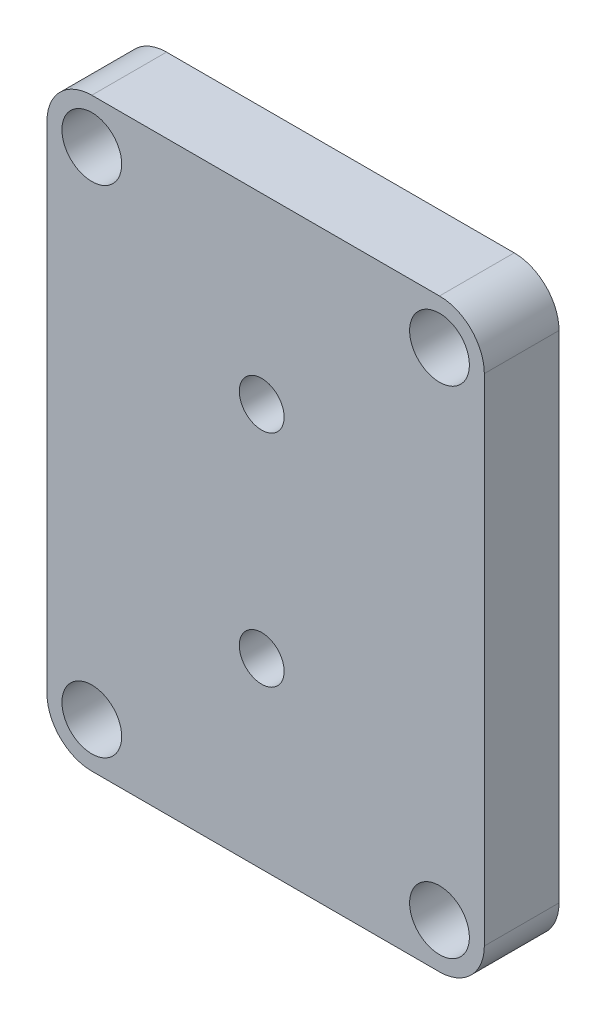
ISO-10303-21;
HEADER;
FILE_DESCRIPTION(('STEP AP214'),'2;1');
FILE_NAME('part.step','',(''),(''),'','','');
FILE_SCHEMA(('AUTOMOTIVE_DESIGN { 1 0 10303 214 1 1 1 1 }'));
ENDSEC;
DATA;
#1=APPLICATION_CONTEXT('core data for automotive mechanical design processes');
#2=APPLICATION_PROTOCOL_DEFINITION('international standard','automotive_design',2000,#1);
#3=PRODUCT_CONTEXT('',#1,'mechanical');
#4=PRODUCT('Part','Part','',(#3));
#5=PRODUCT_RELATED_PRODUCT_CATEGORY('part','',(#4));
#6=PRODUCT_DEFINITION_FORMATION('','',#4);
#7=PRODUCT_DEFINITION_CONTEXT('part definition',#1,'design');
#8=PRODUCT_DEFINITION('design','',#6,#7);
#9=PRODUCT_DEFINITION_SHAPE('','',#8);
#10=(LENGTH_UNIT() NAMED_UNIT(*) SI_UNIT(.MILLI.,.METRE.));
#11=(NAMED_UNIT(*) PLANE_ANGLE_UNIT() SI_UNIT($,.RADIAN.));
#12=(NAMED_UNIT(*) SI_UNIT($,.STERADIAN.) SOLID_ANGLE_UNIT());
#13=UNCERTAINTY_MEASURE_WITH_UNIT(LENGTH_MEASURE(1.E-05),#10,'distance_accuracy_value','');
#14=(GEOMETRIC_REPRESENTATION_CONTEXT(3) GLOBAL_UNCERTAINTY_ASSIGNED_CONTEXT((#13)) GLOBAL_UNIT_ASSIGNED_CONTEXT((#10,
#11,#12)) REPRESENTATION_CONTEXT('',''));
#15=CARTESIAN_POINT('',(0.,0.,0.));
#16=DIRECTION('',(0.,0.,1.));
#17=DIRECTION('',(1.,0.,0.));
#18=AXIS2_PLACEMENT_3D('',#15,#16,#17);
#19=CARTESIAN_POINT('',(3.,-38.624023962144,5.));
#20=DIRECTION('',(0.,0.,-1.));
#21=DIRECTION('',(-1.,0.,0.));
#22=AXIS2_PLACEMENT_3D('',#19,#20,#21);
#23=PLANE('',#22);
#24=CARTESIAN_POINT('',(3.,-38.624023962144,5.));
#25=DIRECTION('',(0.,0.,1.));
#26=DIRECTION('',(-1.,0.,0.));
#27=AXIS2_PLACEMENT_3D('',#24,#25,#26);
#28=CIRCLE('',#27,3.);
#29=CARTESIAN_POINT('',(0.,-38.624023962144,5.));
#30=VERTEX_POINT('',#29);
#31=CARTESIAN_POINT('',(3.,-41.624023962144,5.));
#32=VERTEX_POINT('',#31);
#33=EDGE_CURVE('E147',#30,#32,#28,.T.);
#34=ORIENTED_EDGE('',*,*,#33,.T.);
#35=DIRECTION('',(1.,0.,0.));
#36=VECTOR('',#35,1.);
#37=CARTESIAN_POINT('',(3.,-41.624023962144,5.));
#38=LINE('',#37,#36);
#39=CARTESIAN_POINT('',(26.2719470526514,-41.624023962144,5.));
#40=VERTEX_POINT('',#39);
#41=EDGE_CURVE('E95',#32,#40,#38,.T.);
#42=ORIENTED_EDGE('',*,*,#41,.T.);
#43=CARTESIAN_POINT('',(26.2719470526514,-38.624023962144,5.));
#44=DIRECTION('',(0.,0.,1.));
#45=DIRECTION('',(-1.,0.,0.));
#46=AXIS2_PLACEMENT_3D('',#43,#44,#45);
#47=CIRCLE('',#46,3.);
#48=CARTESIAN_POINT('',(29.2719470526514,-38.624023962144,5.));
#49=VERTEX_POINT('',#48);
#50=EDGE_CURVE('E162',#40,#49,#47,.T.);
#51=ORIENTED_EDGE('',*,*,#50,.T.);
#52=DIRECTION('',(0.,1.,0.));
#53=VECTOR('',#52,1.);
#54=CARTESIAN_POINT('',(29.2719470526514,-5.44464867628751,5.));
#55=LINE('',#54,#53);
#56=CARTESIAN_POINT('',(29.2719470526514,-5.44464867628751,5.));
#57=VERTEX_POINT('',#56);
#58=EDGE_CURVE('E175',#49,#57,#55,.T.);
#59=ORIENTED_EDGE('',*,*,#58,.T.);
#60=CARTESIAN_POINT('',(26.2719470526514,-5.44464867628751,5.));
#61=DIRECTION('',(0.,0.,1.));
#62=DIRECTION('',(1.,0.,0.));
#63=AXIS2_PLACEMENT_3D('',#60,#61,#62);
#64=CIRCLE('',#63,3.);
#65=CARTESIAN_POINT('',(26.2719470526514,-2.44464867628751,5.));
#66=VERTEX_POINT('',#65);
#67=EDGE_CURVE('E114',#57,#66,#64,.T.);
#68=ORIENTED_EDGE('',*,*,#67,.T.);
#69=DIRECTION('',(-1.,0.,0.));
#70=VECTOR('',#69,1.);
#71=CARTESIAN_POINT('',(3.,-2.44464867628751,5.));
#72=LINE('',#71,#70);
#73=CARTESIAN_POINT('',(3.,-2.44464867628751,5.));
#74=VERTEX_POINT('',#73);
#75=EDGE_CURVE('E108',#66,#74,#72,.T.);
#76=ORIENTED_EDGE('',*,*,#75,.T.);
#77=CARTESIAN_POINT('',(3.,-5.44464867628751,5.));
#78=DIRECTION('',(0.,0.,1.));
#79=DIRECTION('',(-1.,0.,0.));
#80=AXIS2_PLACEMENT_3D('',#77,#78,#79);
#81=CIRCLE('',#80,3.);
#82=CARTESIAN_POINT('',(0.,-5.44464867628751,5.));
#83=VERTEX_POINT('',#82);
#84=EDGE_CURVE('E112',#74,#83,#81,.T.);
#85=ORIENTED_EDGE('',*,*,#84,.T.);
#86=DIRECTION('',(0.,-1.,0.));
#87=VECTOR('',#86,1.);
#88=CARTESIAN_POINT('',(0.,-5.44464867628751,5.));
#89=LINE('',#88,#87);
#90=EDGE_CURVE('E52',#83,#30,#89,.T.);
#91=ORIENTED_EDGE('',*,*,#90,.T.);
#92=EDGE_LOOP('',(#34,#42,#51,#59,#68,#76,#85,#91));
#93=FACE_BOUND('',#92,.T.);
#94=CARTESIAN_POINT('',(14.3725774170864,-14.6693363192158,5.));
#95=DIRECTION('',(0.,0.,1.));
#96=DIRECTION('',(1.,0.,0.));
#97=AXIS2_PLACEMENT_3D('',#94,#95,#96);
#98=CIRCLE('',#97,1.5);
#99=CARTESIAN_POINT('',(15.8725774170864,-14.6693363192158,5.));
#100=VERTEX_POINT('',#99);
#101=EDGE_CURVE('E136',#100,#100,#98,.T.);
#102=ORIENTED_EDGE('',*,*,#101,.F.);
#103=EDGE_LOOP('',(#102));
#104=FACE_BOUND('',#103,.T.);
#105=CARTESIAN_POINT('',(14.3725774170864,-29.3993363192158,5.));
#106=DIRECTION('',(0.,0.,1.));
#107=DIRECTION('',(1.,0.,0.));
#108=AXIS2_PLACEMENT_3D('',#105,#106,#107);
#109=CIRCLE('',#108,1.5);
#110=CARTESIAN_POINT('',(15.8725774170864,-29.3993363192158,5.));
#111=VERTEX_POINT('',#110);
#112=EDGE_CURVE('E184',#111,#111,#109,.T.);
#113=ORIENTED_EDGE('',*,*,#112,.F.);
#114=EDGE_LOOP('',(#113));
#115=FACE_BOUND('',#114,.T.);
#116=CARTESIAN_POINT('',(3.,-5.44464867628751,5.));
#117=DIRECTION('',(0.,0.,1.));
#118=DIRECTION('',(1.,0.,0.));
#119=AXIS2_PLACEMENT_3D('',#116,#117,#118);
#120=CIRCLE('',#119,2.);
#121=CARTESIAN_POINT('',(5.,-5.44464867628751,5.));
#122=VERTEX_POINT('',#121);
#123=EDGE_CURVE('E190',#122,#122,#120,.T.);
#124=ORIENTED_EDGE('',*,*,#123,.F.);
#125=EDGE_LOOP('',(#124));
#126=FACE_BOUND('',#125,.T.);
#127=CARTESIAN_POINT('',(26.2719470526514,-5.44464867628751,5.));
#128=DIRECTION('',(0.,0.,1.));
#129=DIRECTION('',(1.,0.,0.));
#130=AXIS2_PLACEMENT_3D('',#127,#128,#129);
#131=CIRCLE('',#130,2.);
#132=CARTESIAN_POINT('',(28.2719470526514,-5.44464867628751,5.));
#133=VERTEX_POINT('',#132);
#134=EDGE_CURVE('E196',#133,#133,#131,.T.);
#135=ORIENTED_EDGE('',*,*,#134,.F.);
#136=EDGE_LOOP('',(#135));
#137=FACE_BOUND('',#136,.T.);
#138=CARTESIAN_POINT('',(3.,-38.624023962144,5.));
#139=DIRECTION('',(0.,0.,1.));
#140=DIRECTION('',(1.,0.,0.));
#141=AXIS2_PLACEMENT_3D('',#138,#139,#140);
#142=CIRCLE('',#141,2.);
#143=CARTESIAN_POINT('',(5.,-38.624023962144,5.));
#144=VERTEX_POINT('',#143);
#145=EDGE_CURVE('E202',#144,#144,#142,.T.);
#146=ORIENTED_EDGE('',*,*,#145,.F.);
#147=EDGE_LOOP('',(#146));
#148=FACE_BOUND('',#147,.T.);
#149=CARTESIAN_POINT('',(26.2719470526514,-38.624023962144,5.));
#150=DIRECTION('',(0.,0.,1.));
#151=DIRECTION('',(1.,0.,0.));
#152=AXIS2_PLACEMENT_3D('',#149,#150,#151);
#153=CIRCLE('',#152,2.);
#154=CARTESIAN_POINT('',(28.2719470526514,-38.624023962144,5.));
#155=VERTEX_POINT('',#154);
#156=EDGE_CURVE('E208',#155,#155,#153,.T.);
#157=ORIENTED_EDGE('',*,*,#156,.F.);
#158=EDGE_LOOP('',(#157));
#159=FACE_BOUND('',#158,.T.);
#160=ADVANCED_FACE('F35',(#93,#104,#115,#126,#137,#148,#159),#23,.F.);
#161=CARTESIAN_POINT('',(3.,-38.624023962144,0.));
#162=DIRECTION('',(0.,0.,-1.));
#163=DIRECTION('',(-1.,0.,0.));
#164=AXIS2_PLACEMENT_3D('',#161,#162,#163);
#165=PLANE('',#164);
#166=CARTESIAN_POINT('',(3.,-38.624023962144,0.));
#167=DIRECTION('',(0.,0.,1.));
#168=DIRECTION('',(1.,0.,0.));
#169=AXIS2_PLACEMENT_3D('',#166,#167,#168);
#170=CIRCLE('',#169,2.);
#171=CARTESIAN_POINT('',(5.,-38.624023962144,0.));
#172=VERTEX_POINT('',#171);
#173=EDGE_CURVE('E205',#172,#172,#170,.T.);
#174=ORIENTED_EDGE('',*,*,#173,.T.);
#175=EDGE_LOOP('',(#174));
#176=FACE_BOUND('',#175,.T.);
#177=CARTESIAN_POINT('',(3.,-5.44464867628751,0.));
#178=DIRECTION('',(0.,0.,1.));
#179=DIRECTION('',(1.,0.,0.));
#180=AXIS2_PLACEMENT_3D('',#177,#178,#179);
#181=CIRCLE('',#180,2.);
#182=CARTESIAN_POINT('',(5.,-5.44464867628751,0.));
#183=VERTEX_POINT('',#182);
#184=EDGE_CURVE('E193',#183,#183,#181,.T.);
#185=ORIENTED_EDGE('',*,*,#184,.T.);
#186=EDGE_LOOP('',(#185));
#187=FACE_BOUND('',#186,.T.);
#188=CARTESIAN_POINT('',(14.3725774170864,-14.6693363192158,0.));
#189=DIRECTION('',(0.,0.,1.));
#190=DIRECTION('',(1.,0.,0.));
#191=AXIS2_PLACEMENT_3D('',#188,#189,#190);
#192=CIRCLE('',#191,1.5);
#193=CARTESIAN_POINT('',(15.8725774170864,-14.6693363192158,0.));
#194=VERTEX_POINT('',#193);
#195=EDGE_CURVE('E181',#194,#194,#192,.T.);
#196=ORIENTED_EDGE('',*,*,#195,.T.);
#197=EDGE_LOOP('',(#196));
#198=FACE_BOUND('',#197,.T.);
#199=CARTESIAN_POINT('',(3.,-38.624023962144,0.));
#200=DIRECTION('',(0.,0.,1.));
#201=DIRECTION('',(-1.,0.,0.));
#202=AXIS2_PLACEMENT_3D('',#199,#200,#201);
#203=CIRCLE('',#202,3.);
#204=CARTESIAN_POINT('',(0.,-38.624023962144,0.));
#205=VERTEX_POINT('',#204);
#206=CARTESIAN_POINT('',(3.,-41.624023962144,0.));
#207=VERTEX_POINT('',#206);
#208=EDGE_CURVE('E132',#205,#207,#203,.T.);
#209=ORIENTED_EDGE('',*,*,#208,.F.);
#210=DIRECTION('',(0.,-1.,0.));
#211=VECTOR('',#210,1.);
#212=CARTESIAN_POINT('',(0.,-5.44464867628751,0.));
#213=LINE('',#212,#211);
#214=CARTESIAN_POINT('',(0.,-5.44464867628751,0.));
#215=VERTEX_POINT('',#214);
#216=EDGE_CURVE('E87',#215,#205,#213,.T.);
#217=ORIENTED_EDGE('',*,*,#216,.F.);
#218=CARTESIAN_POINT('',(3.,-5.44464867628751,0.));
#219=DIRECTION('',(0.,0.,1.));
#220=DIRECTION('',(-1.,0.,0.));
#221=AXIS2_PLACEMENT_3D('',#218,#219,#220);
#222=CIRCLE('',#221,3.);
#223=CARTESIAN_POINT('',(3.,-2.44464867628751,0.));
#224=VERTEX_POINT('',#223);
#225=EDGE_CURVE('E81',#224,#215,#222,.T.);
#226=ORIENTED_EDGE('',*,*,#225,.F.);
#227=DIRECTION('',(-1.,0.,0.));
#228=VECTOR('',#227,1.);
#229=CARTESIAN_POINT('',(3.,-2.44464867628751,0.));
#230=LINE('',#229,#228);
#231=CARTESIAN_POINT('',(26.2719470526514,-2.44464867628751,0.));
#232=VERTEX_POINT('',#231);
#233=EDGE_CURVE('E122',#232,#224,#230,.T.);
#234=ORIENTED_EDGE('',*,*,#233,.F.);
#235=CARTESIAN_POINT('',(26.2719470526514,-5.44464867628751,0.));
#236=DIRECTION('',(0.,0.,1.));
#237=DIRECTION('',(1.,0.,0.));
#238=AXIS2_PLACEMENT_3D('',#235,#236,#237);
#239=CIRCLE('',#238,3.);
#240=CARTESIAN_POINT('',(29.2719470526514,-5.44464867628751,0.));
#241=VERTEX_POINT('',#240);
#242=EDGE_CURVE('E142',#241,#232,#239,.T.);
#243=ORIENTED_EDGE('',*,*,#242,.F.);
#244=DIRECTION('',(0.,1.,0.));
#245=VECTOR('',#244,1.);
#246=CARTESIAN_POINT('',(29.2719470526514,-5.44464867628751,0.));
#247=LINE('',#246,#245);
#248=CARTESIAN_POINT('',(29.2719470526514,-38.624023962144,0.));
#249=VERTEX_POINT('',#248);
#250=EDGE_CURVE('E140',#249,#241,#247,.T.);
#251=ORIENTED_EDGE('',*,*,#250,.F.);
#252=CARTESIAN_POINT('',(26.2719470526514,-38.624023962144,0.));
#253=DIRECTION('',(0.,0.,1.));
#254=DIRECTION('',(-1.,0.,0.));
#255=AXIS2_PLACEMENT_3D('',#252,#253,#254);
#256=CIRCLE('',#255,3.);
#257=CARTESIAN_POINT('',(26.2719470526514,-41.624023962144,0.));
#258=VERTEX_POINT('',#257);
#259=EDGE_CURVE('E138',#258,#249,#256,.T.);
#260=ORIENTED_EDGE('',*,*,#259,.F.);
#261=DIRECTION('',(1.,0.,0.));
#262=VECTOR('',#261,1.);
#263=CARTESIAN_POINT('',(3.,-41.624023962144,0.));
#264=LINE('',#263,#262);
#265=EDGE_CURVE('E135',#207,#258,#264,.T.);
#266=ORIENTED_EDGE('',*,*,#265,.F.);
#267=EDGE_LOOP('',(#209,#217,#226,#234,#243,#251,#260,#266));
#268=FACE_BOUND('',#267,.T.);
#269=CARTESIAN_POINT('',(14.3725774170864,-29.3993363192158,0.));
#270=DIRECTION('',(0.,0.,1.));
#271=DIRECTION('',(1.,0.,0.));
#272=AXIS2_PLACEMENT_3D('',#269,#270,#271);
#273=CIRCLE('',#272,1.5);
#274=CARTESIAN_POINT('',(15.8725774170864,-29.3993363192158,0.));
#275=VERTEX_POINT('',#274);
#276=EDGE_CURVE('E187',#275,#275,#273,.T.);
#277=ORIENTED_EDGE('',*,*,#276,.T.);
#278=EDGE_LOOP('',(#277));
#279=FACE_BOUND('',#278,.T.);
#280=CARTESIAN_POINT('',(26.2719470526514,-5.44464867628751,0.));
#281=DIRECTION('',(0.,0.,1.));
#282=DIRECTION('',(1.,0.,0.));
#283=AXIS2_PLACEMENT_3D('',#280,#281,#282);
#284=CIRCLE('',#283,2.);
#285=CARTESIAN_POINT('',(28.2719470526514,-5.44464867628751,0.));
#286=VERTEX_POINT('',#285);
#287=EDGE_CURVE('E199',#286,#286,#284,.T.);
#288=ORIENTED_EDGE('',*,*,#287,.T.);
#289=EDGE_LOOP('',(#288));
#290=FACE_BOUND('',#289,.T.);
#291=CARTESIAN_POINT('',(26.2719470526514,-38.624023962144,0.));
#292=DIRECTION('',(0.,0.,1.));
#293=DIRECTION('',(1.,0.,0.));
#294=AXIS2_PLACEMENT_3D('',#291,#292,#293);
#295=CIRCLE('',#294,2.);
#296=CARTESIAN_POINT('',(28.2719470526514,-38.624023962144,0.));
#297=VERTEX_POINT('',#296);
#298=EDGE_CURVE('E211',#297,#297,#295,.T.);
#299=ORIENTED_EDGE('',*,*,#298,.T.);
#300=EDGE_LOOP('',(#299));
#301=FACE_BOUND('',#300,.T.);
#302=ADVANCED_FACE('F166',(#176,#187,#198,#268,#279,#290,#301),#165,.T.);
#303=CARTESIAN_POINT('',(3.,-38.624023962144,5.));
#304=DIRECTION('',(0.,0.,-1.));
#305=DIRECTION('',(-1.,0.,0.));
#306=AXIS2_PLACEMENT_3D('',#303,#304,#305);
#307=CYLINDRICAL_SURFACE('',#306,3.);
#308=ORIENTED_EDGE('',*,*,#208,.T.);
#309=DIRECTION('',(0.,0.,-1.));
#310=VECTOR('',#309,1.);
#311=CARTESIAN_POINT('',(3.,-41.624023962144,5.));
#312=LINE('',#311,#310);
#313=EDGE_CURVE('E11',#32,#207,#312,.T.);
#314=ORIENTED_EDGE('',*,*,#313,.F.);
#315=ORIENTED_EDGE('',*,*,#33,.F.);
#316=DIRECTION('',(0.,0.,-1.));
#317=VECTOR('',#316,1.);
#318=CARTESIAN_POINT('',(0.,-38.624023962144,5.));
#319=LINE('',#318,#317);
#320=EDGE_CURVE('E128',#30,#205,#319,.T.);
#321=ORIENTED_EDGE('',*,*,#320,.T.);
#322=EDGE_LOOP('',(#308,#314,#315,#321));
#323=FACE_BOUND('',#322,.T.);
#324=ADVANCED_FACE('F37',(#323),#307,.T.);
#325=CARTESIAN_POINT('',(3.,-41.624023962144,5.));
#326=DIRECTION('',(0.,1.,0.));
#327=DIRECTION('',(0.,0.,1.));
#328=AXIS2_PLACEMENT_3D('',#325,#326,#327);
#329=PLANE('',#328);
#330=ORIENTED_EDGE('',*,*,#265,.T.);
#331=DIRECTION('',(0.,0.,-1.));
#332=VECTOR('',#331,1.);
#333=CARTESIAN_POINT('',(26.2719470526514,-41.624023962144,5.));
#334=LINE('',#333,#332);
#335=EDGE_CURVE('E44',#40,#258,#334,.T.);
#336=ORIENTED_EDGE('',*,*,#335,.F.);
#337=ORIENTED_EDGE('',*,*,#41,.F.);
#338=ORIENTED_EDGE('',*,*,#313,.T.);
#339=EDGE_LOOP('',(#330,#336,#337,#338));
#340=FACE_BOUND('',#339,.T.);
#341=ADVANCED_FACE('F243',(#340),#329,.F.);
#342=CARTESIAN_POINT('',(26.2719470526514,-38.624023962144,5.));
#343=DIRECTION('',(0.,0.,-1.));
#344=DIRECTION('',(-1.,0.,0.));
#345=AXIS2_PLACEMENT_3D('',#342,#343,#344);
#346=CYLINDRICAL_SURFACE('',#345,3.);
#347=ORIENTED_EDGE('',*,*,#259,.T.);
#348=DIRECTION('',(0.,0.,-1.));
#349=VECTOR('',#348,1.);
#350=CARTESIAN_POINT('',(29.2719470526514,-38.624023962144,5.));
#351=LINE('',#350,#349);
#352=EDGE_CURVE('E154',#49,#249,#351,.T.);
#353=ORIENTED_EDGE('',*,*,#352,.F.);
#354=ORIENTED_EDGE('',*,*,#50,.F.);
#355=ORIENTED_EDGE('',*,*,#335,.T.);
#356=EDGE_LOOP('',(#347,#353,#354,#355));
#357=FACE_BOUND('',#356,.T.);
#358=ADVANCED_FACE('F160',(#357),#346,.T.);
#359=CARTESIAN_POINT('',(29.2719470526514,-5.44464867628751,5.));
#360=DIRECTION('',(-1.,0.,0.));
#361=DIRECTION('',(0.,0.,1.));
#362=AXIS2_PLACEMENT_3D('',#359,#360,#361);
#363=PLANE('',#362);
#364=ORIENTED_EDGE('',*,*,#250,.T.);
#365=DIRECTION('',(0.,0.,-1.));
#366=VECTOR('',#365,1.);
#367=CARTESIAN_POINT('',(29.2719470526514,-5.44464867628751,5.));
#368=LINE('',#367,#366);
#369=EDGE_CURVE('E151',#57,#241,#368,.T.);
#370=ORIENTED_EDGE('',*,*,#369,.F.);
#371=ORIENTED_EDGE('',*,*,#58,.F.);
#372=ORIENTED_EDGE('',*,*,#352,.T.);
#373=EDGE_LOOP('',(#364,#370,#371,#372));
#374=FACE_BOUND('',#373,.T.);
#375=ADVANCED_FACE('F171',(#374),#363,.F.);
#376=CARTESIAN_POINT('',(26.2719470526514,-5.44464867628751,5.));
#377=DIRECTION('',(0.,0.,-1.));
#378=DIRECTION('',(-1.,0.,0.));
#379=AXIS2_PLACEMENT_3D('',#376,#377,#378);
#380=CYLINDRICAL_SURFACE('',#379,3.);
#381=ORIENTED_EDGE('',*,*,#242,.T.);
#382=DIRECTION('',(0.,0.,-1.));
#383=VECTOR('',#382,1.);
#384=CARTESIAN_POINT('',(26.2719470526514,-2.44464867628751,5.));
#385=LINE('',#384,#383);
#386=EDGE_CURVE('E123',#66,#232,#385,.T.);
#387=ORIENTED_EDGE('',*,*,#386,.F.);
#388=ORIENTED_EDGE('',*,*,#67,.F.);
#389=ORIENTED_EDGE('',*,*,#369,.T.);
#390=EDGE_LOOP('',(#381,#387,#388,#389));
#391=FACE_BOUND('',#390,.T.);
#392=ADVANCED_FACE('F174',(#391),#380,.T.);
#393=CARTESIAN_POINT('',(3.,-2.44464867628751,5.));
#394=DIRECTION('',(0.,-1.,0.));
#395=DIRECTION('',(0.,0.,-1.));
#396=AXIS2_PLACEMENT_3D('',#393,#394,#395);
#397=PLANE('',#396);
#398=ORIENTED_EDGE('',*,*,#233,.T.);
#399=DIRECTION('',(0.,0.,-1.));
#400=VECTOR('',#399,1.);
#401=CARTESIAN_POINT('',(3.,-2.44464867628751,5.));
#402=LINE('',#401,#400);
#403=EDGE_CURVE('E119',#74,#224,#402,.T.);
#404=ORIENTED_EDGE('',*,*,#403,.F.);
#405=ORIENTED_EDGE('',*,*,#75,.F.);
#406=ORIENTED_EDGE('',*,*,#386,.T.);
#407=EDGE_LOOP('',(#398,#404,#405,#406));
#408=FACE_BOUND('',#407,.T.);
#409=ADVANCED_FACE('F120',(#408),#397,.F.);
#410=CARTESIAN_POINT('',(3.,-5.44464867628751,5.));
#411=DIRECTION('',(0.,0.,-1.));
#412=DIRECTION('',(-1.,0.,0.));
#413=AXIS2_PLACEMENT_3D('',#410,#411,#412);
#414=CYLINDRICAL_SURFACE('',#413,3.);
#415=ORIENTED_EDGE('',*,*,#225,.T.);
#416=DIRECTION('',(0.,0.,-1.));
#417=VECTOR('',#416,1.);
#418=CARTESIAN_POINT('',(0.,-5.44464867628751,5.));
#419=LINE('',#418,#417);
#420=EDGE_CURVE('E124',#83,#215,#419,.T.);
#421=ORIENTED_EDGE('',*,*,#420,.F.);
#422=ORIENTED_EDGE('',*,*,#84,.F.);
#423=ORIENTED_EDGE('',*,*,#403,.T.);
#424=EDGE_LOOP('',(#415,#421,#422,#423));
#425=FACE_BOUND('',#424,.T.);
#426=ADVANCED_FACE('F126',(#425),#414,.T.);
#427=CARTESIAN_POINT('',(0.,-5.44464867628751,5.));
#428=DIRECTION('',(1.,0.,0.));
#429=DIRECTION('',(0.,0.,-1.));
#430=AXIS2_PLACEMENT_3D('',#427,#428,#429);
#431=PLANE('',#430);
#432=ORIENTED_EDGE('',*,*,#216,.T.);
#433=ORIENTED_EDGE('',*,*,#320,.F.);
#434=ORIENTED_EDGE('',*,*,#90,.F.);
#435=ORIENTED_EDGE('',*,*,#420,.T.);
#436=EDGE_LOOP('',(#432,#433,#434,#435));
#437=FACE_BOUND('',#436,.T.);
#438=ADVANCED_FACE('F231',(#437),#431,.F.);
#439=CARTESIAN_POINT('',(14.3725774170864,-14.6693363192158,5.));
#440=DIRECTION('',(0.,0.,-1.));
#441=DIRECTION('',(-1.,0.,0.));
#442=AXIS2_PLACEMENT_3D('',#439,#440,#441);
#443=CYLINDRICAL_SURFACE('',#442,1.5);
#444=ORIENTED_EDGE('',*,*,#101,.T.);
#445=EDGE_LOOP('',(#444));
#446=FACE_BOUND('',#445,.T.);
#447=ORIENTED_EDGE('',*,*,#195,.F.);
#448=EDGE_LOOP('',(#447));
#449=FACE_BOUND('',#448,.T.);
#450=ADVANCED_FACE('F228',(#446,#449),#443,.F.);
#451=CARTESIAN_POINT('',(14.3725774170864,-29.3993363192158,5.));
#452=DIRECTION('',(0.,0.,-1.));
#453=DIRECTION('',(-1.,0.,0.));
#454=AXIS2_PLACEMENT_3D('',#451,#452,#453);
#455=CYLINDRICAL_SURFACE('',#454,1.5);
#456=ORIENTED_EDGE('',*,*,#112,.T.);
#457=EDGE_LOOP('',(#456));
#458=FACE_BOUND('',#457,.T.);
#459=ORIENTED_EDGE('',*,*,#276,.F.);
#460=EDGE_LOOP('',(#459));
#461=FACE_BOUND('',#460,.T.);
#462=ADVANCED_FACE('F307',(#458,#461),#455,.F.);
#463=CARTESIAN_POINT('',(3.,-5.44464867628751,5.));
#464=DIRECTION('',(0.,0.,-1.));
#465=DIRECTION('',(-1.,0.,0.));
#466=AXIS2_PLACEMENT_3D('',#463,#464,#465);
#467=CYLINDRICAL_SURFACE('',#466,2.);
#468=ORIENTED_EDGE('',*,*,#123,.T.);
#469=EDGE_LOOP('',(#468));
#470=FACE_BOUND('',#469,.T.);
#471=ORIENTED_EDGE('',*,*,#184,.F.);
#472=EDGE_LOOP('',(#471));
#473=FACE_BOUND('',#472,.T.);
#474=ADVANCED_FACE('F315',(#470,#473),#467,.F.);
#475=CARTESIAN_POINT('',(26.2719470526514,-5.44464867628751,5.));
#476=DIRECTION('',(0.,0.,-1.));
#477=DIRECTION('',(-1.,0.,0.));
#478=AXIS2_PLACEMENT_3D('',#475,#476,#477);
#479=CYLINDRICAL_SURFACE('',#478,2.);
#480=ORIENTED_EDGE('',*,*,#134,.T.);
#481=EDGE_LOOP('',(#480));
#482=FACE_BOUND('',#481,.T.);
#483=ORIENTED_EDGE('',*,*,#287,.F.);
#484=EDGE_LOOP('',(#483));
#485=FACE_BOUND('',#484,.T.);
#486=ADVANCED_FACE('F323',(#482,#485),#479,.F.);
#487=CARTESIAN_POINT('',(3.,-38.624023962144,5.));
#488=DIRECTION('',(0.,0.,-1.));
#489=DIRECTION('',(-1.,0.,0.));
#490=AXIS2_PLACEMENT_3D('',#487,#488,#489);
#491=CYLINDRICAL_SURFACE('',#490,2.);
#492=ORIENTED_EDGE('',*,*,#145,.T.);
#493=EDGE_LOOP('',(#492));
#494=FACE_BOUND('',#493,.T.);
#495=ORIENTED_EDGE('',*,*,#173,.F.);
#496=EDGE_LOOP('',(#495));
#497=FACE_BOUND('',#496,.T.);
#498=ADVANCED_FACE('F332',(#494,#497),#491,.F.);
#499=CARTESIAN_POINT('',(26.2719470526514,-38.624023962144,5.));
#500=DIRECTION('',(0.,0.,-1.));
#501=DIRECTION('',(-1.,0.,0.));
#502=AXIS2_PLACEMENT_3D('',#499,#500,#501);
#503=CYLINDRICAL_SURFACE('',#502,2.);
#504=ORIENTED_EDGE('',*,*,#156,.T.);
#505=EDGE_LOOP('',(#504));
#506=FACE_BOUND('',#505,.T.);
#507=ORIENTED_EDGE('',*,*,#298,.F.);
#508=EDGE_LOOP('',(#507));
#509=FACE_BOUND('',#508,.T.);
#510=ADVANCED_FACE('F217',(#506,#509),#503,.F.);
#511=CLOSED_SHELL('',(#160,#302,#324,#341,#358,#375,#392,#409,#426,#438,#450,#462,#474,#486,
#498,#510));
#512=MANIFOLD_SOLID_BREP('B2',#511);
#513=ADVANCED_BREP_SHAPE_REPRESENTATION('',(#18,#512),#14);
#514=SHAPE_DEFINITION_REPRESENTATION(#9,#513);
ENDSEC;
END-ISO-10303-21;
